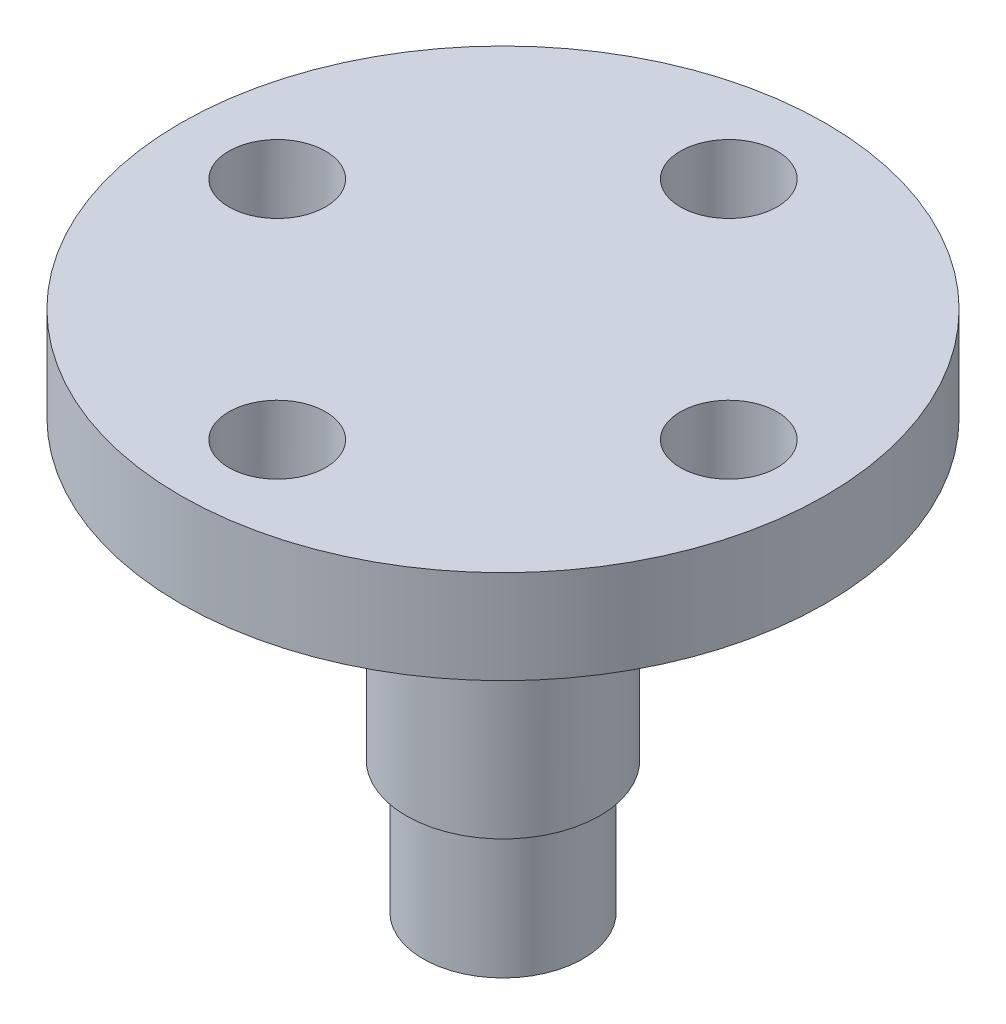
ISO-10303-21;
HEADER;
FILE_DESCRIPTION(('STEP AP214'),'2;1');
FILE_NAME('part.step','',(''),(''),'','','');
FILE_SCHEMA(('AUTOMOTIVE_DESIGN { 1 0 10303 214 1 1 1 1 }'));
ENDSEC;
DATA;
#1=APPLICATION_CONTEXT('core data for automotive mechanical design processes');
#2=APPLICATION_PROTOCOL_DEFINITION('international standard','automotive_design',2000,#1);
#3=PRODUCT_CONTEXT('',#1,'mechanical');
#4=PRODUCT('Part','Part','',(#3));
#5=PRODUCT_RELATED_PRODUCT_CATEGORY('part','',(#4));
#6=PRODUCT_DEFINITION_FORMATION('','',#4);
#7=PRODUCT_DEFINITION_CONTEXT('part definition',#1,'design');
#8=PRODUCT_DEFINITION('design','',#6,#7);
#9=PRODUCT_DEFINITION_SHAPE('','',#8);
#10=(LENGTH_UNIT() NAMED_UNIT(*) SI_UNIT(.MILLI.,.METRE.));
#11=(NAMED_UNIT(*) PLANE_ANGLE_UNIT() SI_UNIT($,.RADIAN.));
#12=(NAMED_UNIT(*) SI_UNIT($,.STERADIAN.) SOLID_ANGLE_UNIT());
#13=UNCERTAINTY_MEASURE_WITH_UNIT(LENGTH_MEASURE(1.E-05),#10,'distance_accuracy_value','');
#14=(GEOMETRIC_REPRESENTATION_CONTEXT(3) GLOBAL_UNCERTAINTY_ASSIGNED_CONTEXT((#13)) GLOBAL_UNIT_ASSIGNED_CONTEXT((#10,
#11,#12)) REPRESENTATION_CONTEXT('',''));
#15=CARTESIAN_POINT('',(0.,0.,0.));
#16=DIRECTION('',(0.,0.,1.));
#17=DIRECTION('',(1.,0.,0.));
#18=AXIS2_PLACEMENT_3D('',#15,#16,#17);
#19=CARTESIAN_POINT('',(-1.78635150621402,9.47796080297397,0.));
#20=DIRECTION('',(0.,-1.,0.));
#21=DIRECTION('',(0.,0.,-1.));
#22=AXIS2_PLACEMENT_3D('',#19,#20,#21);
#23=PLANE('',#22);
#24=CARTESIAN_POINT('',(-1.78635150621402,9.47796080297397,0.));
#25=DIRECTION('',(0.,1.,0.));
#26=DIRECTION('',(0.,0.,-1.));
#27=AXIS2_PLACEMENT_3D('',#24,#25,#26);
#28=CIRCLE('',#27,3.975);
#29=CARTESIAN_POINT('',(-1.78635150621402,9.47796080297397,-3.975));
#30=VERTEX_POINT('',#29);
#31=EDGE_CURVE('E81',#30,#30,#28,.T.);
#32=ORIENTED_EDGE('',*,*,#31,.T.);
#33=EDGE_LOOP('',(#32));
#34=FACE_BOUND('',#33,.T.);
#35=CARTESIAN_POINT('',(5.21364849377225,9.47796080297397,0.));
#36=DIRECTION('',(0.,1.,0.));
#37=DIRECTION('',(0.,0.,-1.));
#38=AXIS2_PLACEMENT_3D('',#35,#36,#37);
#39=CIRCLE('',#38,1.5);
#40=CARTESIAN_POINT('',(5.21364849377225,9.47796080297397,-1.49999999999995));
#41=VERTEX_POINT('',#40);
#42=EDGE_CURVE('E48',#41,#41,#39,.T.);
#43=ORIENTED_EDGE('',*,*,#42,.T.);
#44=EDGE_LOOP('',(#43));
#45=FACE_BOUND('',#44,.T.);
#46=CARTESIAN_POINT('',(-1.786351506214,9.47796080297397,-6.99999999998627));
#47=DIRECTION('',(0.,1.,0.));
#48=DIRECTION('',(0.,0.,-1.));
#49=AXIS2_PLACEMENT_3D('',#46,#47,#48);
#50=CIRCLE('',#49,1.5);
#51=CARTESIAN_POINT('',(-1.786351506214,9.47796080297397,-8.49999999998627));
#52=VERTEX_POINT('',#51);
#53=EDGE_CURVE('E49',#52,#52,#50,.T.);
#54=ORIENTED_EDGE('',*,*,#53,.T.);
#55=EDGE_LOOP('',(#54));
#56=FACE_BOUND('',#55,.T.);
#57=CARTESIAN_POINT('',(-8.7863515062003,9.47796080297397,0.));
#58=DIRECTION('',(0.,1.,0.));
#59=DIRECTION('',(0.,0.,-1.));
#60=AXIS2_PLACEMENT_3D('',#57,#58,#59);
#61=CIRCLE('',#60,1.5);
#62=CARTESIAN_POINT('',(-8.7863515062003,9.47796080297397,-1.5));
#63=VERTEX_POINT('',#62);
#64=EDGE_CURVE('E54',#63,#63,#61,.T.);
#65=ORIENTED_EDGE('',*,*,#64,.T.);
#66=EDGE_LOOP('',(#65));
#67=FACE_BOUND('',#66,.T.);
#68=CARTESIAN_POINT('',(-1.786351506214,9.47796080297397,6.99999999998627));
#69=DIRECTION('',(0.,1.,0.));
#70=DIRECTION('',(0.,0.,-1.));
#71=AXIS2_PLACEMENT_3D('',#68,#69,#70);
#72=CIRCLE('',#71,1.5);
#73=CARTESIAN_POINT('',(-1.786351506214,9.47796080297397,5.49999999998627));
#74=VERTEX_POINT('',#73);
#75=EDGE_CURVE('E55',#74,#74,#72,.T.);
#76=ORIENTED_EDGE('',*,*,#75,.T.);
#77=EDGE_LOOP('',(#76));
#78=FACE_BOUND('',#77,.T.);
#79=CARTESIAN_POINT('',(-1.78635150621402,9.47796080297397,0.));
#80=DIRECTION('',(0.,-1.,0.));
#81=DIRECTION('',(0.,0.,-1.));
#82=AXIS2_PLACEMENT_3D('',#79,#80,#81);
#83=CIRCLE('',#82,10.0000000000246);
#84=CARTESIAN_POINT('',(-1.78635150621402,9.47796080297397,-10.0000000000246));
#85=VERTEX_POINT('',#84);
#86=EDGE_CURVE('E138',#85,#85,#83,.T.);
#87=ORIENTED_EDGE('',*,*,#86,.T.);
#88=EDGE_LOOP('',(#87));
#89=FACE_BOUND('',#88,.T.);
#90=ADVANCED_FACE('F15',(#34,#45,#56,#67,#78,#89),#23,.T.);
#91=CARTESIAN_POINT('',(-1.78635150621402,12.3779608029706,0.));
#92=DIRECTION('',(0.,1.,0.));
#93=DIRECTION('',(1.,0.,0.));
#94=AXIS2_PLACEMENT_3D('',#91,#92,#93);
#95=PLANE('',#94);
#96=CARTESIAN_POINT('',(5.21364849377225,12.3779608029706,0.));
#97=DIRECTION('',(0.,-1.,0.));
#98=DIRECTION('',(0.,0.,1.));
#99=AXIS2_PLACEMENT_3D('',#96,#97,#98);
#100=CIRCLE('',#99,1.5);
#101=CARTESIAN_POINT('',(5.21364849377225,12.3779608029706,1.50000000000005));
#102=VERTEX_POINT('',#101);
#103=EDGE_CURVE('E74',#102,#102,#100,.T.);
#104=ORIENTED_EDGE('',*,*,#103,.T.);
#105=EDGE_LOOP('',(#104));
#106=FACE_BOUND('',#105,.T.);
#107=CARTESIAN_POINT('',(-1.786351506214,12.3779608029706,-6.99999999998627));
#108=DIRECTION('',(0.,-1.,0.));
#109=DIRECTION('',(0.,0.,1.));
#110=AXIS2_PLACEMENT_3D('',#107,#108,#109);
#111=CIRCLE('',#110,1.5);
#112=CARTESIAN_POINT('',(-1.786351506214,12.3779608029706,-5.49999999998627));
#113=VERTEX_POINT('',#112);
#114=EDGE_CURVE('E44',#113,#113,#111,.T.);
#115=ORIENTED_EDGE('',*,*,#114,.T.);
#116=EDGE_LOOP('',(#115));
#117=FACE_BOUND('',#116,.T.);
#118=CARTESIAN_POINT('',(-8.7863515062003,12.3779608029706,0.));
#119=DIRECTION('',(0.,-1.,0.));
#120=DIRECTION('',(0.,0.,1.));
#121=AXIS2_PLACEMENT_3D('',#118,#119,#120);
#122=CIRCLE('',#121,1.5);
#123=CARTESIAN_POINT('',(-8.7863515062003,12.3779608029706,1.5));
#124=VERTEX_POINT('',#123);
#125=EDGE_CURVE('E59',#124,#124,#122,.T.);
#126=ORIENTED_EDGE('',*,*,#125,.T.);
#127=EDGE_LOOP('',(#126));
#128=FACE_BOUND('',#127,.T.);
#129=CARTESIAN_POINT('',(-1.786351506214,12.3779608029706,6.99999999998627));
#130=DIRECTION('',(0.,-1.,0.));
#131=DIRECTION('',(0.,0.,1.));
#132=AXIS2_PLACEMENT_3D('',#129,#130,#131);
#133=CIRCLE('',#132,1.5);
#134=CARTESIAN_POINT('',(-1.786351506214,12.3779608029706,8.49999999998627));
#135=VERTEX_POINT('',#134);
#136=EDGE_CURVE('E50',#135,#135,#133,.T.);
#137=ORIENTED_EDGE('',*,*,#136,.T.);
#138=EDGE_LOOP('',(#137));
#139=FACE_BOUND('',#138,.T.);
#140=CARTESIAN_POINT('',(-1.78635150621402,12.3779608029706,0.));
#141=DIRECTION('',(0.,1.,0.));
#142=DIRECTION('',(0.,0.,1.));
#143=AXIS2_PLACEMENT_3D('',#140,#141,#142);
#144=CIRCLE('',#143,10.0000000000246);
#145=CARTESIAN_POINT('',(-1.78635150621402,12.3779608029706,10.0000000000246));
#146=VERTEX_POINT('',#145);
#147=EDGE_CURVE('E42',#146,#146,#144,.T.);
#148=ORIENTED_EDGE('',*,*,#147,.T.);
#149=EDGE_LOOP('',(#148));
#150=FACE_BOUND('',#149,.T.);
#151=ADVANCED_FACE('F118',(#106,#117,#128,#139,#150),#95,.T.);
#152=CARTESIAN_POINT('',(-1.78635150621402,-3.82203919697574,0.));
#153=DIRECTION('',(0.,-1.,0.));
#154=DIRECTION('',(0.,0.,-1.));
#155=AXIS2_PLACEMENT_3D('',#152,#153,#154);
#156=PLANE('',#155);
#157=CARTESIAN_POINT('',(-1.78635150621402,-3.82203919697574,0.));
#158=DIRECTION('',(0.,1.,0.));
#159=DIRECTION('',(0.,0.,-1.));
#160=AXIS2_PLACEMENT_3D('',#157,#158,#159);
#161=CIRCLE('',#160,1.05);
#162=CARTESIAN_POINT('',(-1.78635150621402,-3.82203919697574,-1.05));
#163=VERTEX_POINT('',#162);
#164=EDGE_CURVE('E31',#163,#163,#161,.T.);
#165=ORIENTED_EDGE('',*,*,#164,.T.);
#166=EDGE_LOOP('',(#165));
#167=FACE_BOUND('',#166,.T.);
#168=CARTESIAN_POINT('',(-1.78635150621402,-3.82203919697574,0.));
#169=DIRECTION('',(0.,-1.,0.));
#170=DIRECTION('',(0.,0.,-1.));
#171=AXIS2_PLACEMENT_3D('',#168,#169,#170);
#172=CIRCLE('',#171,2.48);
#173=CARTESIAN_POINT('',(-1.78635150621402,-3.82203919697574,-2.48));
#174=VERTEX_POINT('',#173);
#175=EDGE_CURVE('E63',#174,#174,#172,.T.);
#176=ORIENTED_EDGE('',*,*,#175,.T.);
#177=EDGE_LOOP('',(#176));
#178=FACE_BOUND('',#177,.T.);
#179=ADVANCED_FACE('F123',(#167,#178),#156,.T.);
#180=CARTESIAN_POINT('',(-1.78635150621402,-1.82203919697573,0.));
#181=DIRECTION('',(0.,-1.,0.));
#182=DIRECTION('',(0.,0.,-1.));
#183=AXIS2_PLACEMENT_3D('',#180,#181,#182);
#184=PLANE('',#183);
#185=CARTESIAN_POINT('',(-1.78635150621402,-1.82203919697573,0.));
#186=DIRECTION('',(0.,-1.,0.));
#187=DIRECTION('',(0.,0.,-1.));
#188=AXIS2_PLACEMENT_3D('',#185,#186,#187);
#189=CIRCLE('',#188,1.05);
#190=CARTESIAN_POINT('',(-1.78635150621402,-1.82203919697573,-1.05));
#191=VERTEX_POINT('',#190);
#192=EDGE_CURVE('E39',#191,#191,#189,.T.);
#193=ORIENTED_EDGE('',*,*,#192,.T.);
#194=EDGE_LOOP('',(#193));
#195=FACE_BOUND('',#194,.T.);
#196=ADVANCED_FACE('F302',(#195),#184,.T.);
#197=CARTESIAN_POINT('',(-1.78635150621402,0.277960802973146,0.));
#198=DIRECTION('',(0.,-1.,0.));
#199=DIRECTION('',(0.,0.,-1.));
#200=AXIS2_PLACEMENT_3D('',#197,#198,#199);
#201=PLANE('',#200);
#202=CARTESIAN_POINT('',(-1.78635150621402,0.277960802973146,0.));
#203=DIRECTION('',(0.,1.,0.));
#204=DIRECTION('',(0.,0.,-1.));
#205=AXIS2_PLACEMENT_3D('',#202,#203,#204);
#206=CIRCLE('',#205,2.48);
#207=CARTESIAN_POINT('',(-1.78635150621402,0.277960802973146,-2.48));
#208=VERTEX_POINT('',#207);
#209=EDGE_CURVE('E67',#208,#208,#206,.T.);
#210=ORIENTED_EDGE('',*,*,#209,.T.);
#211=EDGE_LOOP('',(#210));
#212=FACE_BOUND('',#211,.T.);
#213=CARTESIAN_POINT('',(-1.78635150621402,0.277960802973146,0.));
#214=DIRECTION('',(0.,-1.,0.));
#215=DIRECTION('',(0.,0.,-1.));
#216=AXIS2_PLACEMENT_3D('',#213,#214,#215);
#217=CIRCLE('',#216,3.00000000002456);
#218=CARTESIAN_POINT('',(-1.78635150621402,0.277960802973146,-3.00000000002456));
#219=VERTEX_POINT('',#218);
#220=EDGE_CURVE('E22',#219,#219,#217,.T.);
#221=ORIENTED_EDGE('',*,*,#220,.T.);
#222=EDGE_LOOP('',(#221));
#223=FACE_BOUND('',#222,.T.);
#224=ADVANCED_FACE('F95',(#212,#223),#201,.T.);
#225=CARTESIAN_POINT('',(0.,5.97796080298245,0.));
#226=DIRECTION('',(0.,1.,0.));
#227=DIRECTION('',(1.,0.,0.));
#228=AXIS2_PLACEMENT_3D('',#225,#226,#227);
#229=PLANE('',#228);
#230=CARTESIAN_POINT('',(-1.78635150621402,5.97796080298529,0.));
#231=DIRECTION('',(0.,1.,0.));
#232=DIRECTION('',(0.,0.,1.));
#233=AXIS2_PLACEMENT_3D('',#230,#231,#232);
#234=CIRCLE('',#233,3.00000000002456);
#235=CARTESIAN_POINT('',(-1.78635150621402,5.97796080298529,3.00000000002456));
#236=VERTEX_POINT('',#235);
#237=EDGE_CURVE('E10',#236,#236,#234,.T.);
#238=ORIENTED_EDGE('',*,*,#237,.T.);
#239=EDGE_LOOP('',(#238));
#240=FACE_BOUND('',#239,.T.);
#241=CARTESIAN_POINT('',(-1.78635150621402,5.97796080298245,0.));
#242=DIRECTION('',(0.,-1.,0.));
#243=DIRECTION('',(0.,0.,-1.));
#244=AXIS2_PLACEMENT_3D('',#241,#242,#243);
#245=CIRCLE('',#244,3.975);
#246=CARTESIAN_POINT('',(-1.78635150621402,5.97796080298245,-3.975));
#247=VERTEX_POINT('',#246);
#248=EDGE_CURVE('E85',#247,#247,#245,.T.);
#249=ORIENTED_EDGE('',*,*,#248,.T.);
#250=EDGE_LOOP('',(#249));
#251=FACE_BOUND('',#250,.T.);
#252=ADVANCED_FACE('F282',(#240,#251),#229,.F.);
#253=CARTESIAN_POINT('',(-1.78635150621402,28.3779608029711,0.));
#254=DIRECTION('',(0.,1.,0.));
#255=DIRECTION('',(0.,0.,1.));
#256=AXIS2_PLACEMENT_3D('',#253,#254,#255);
#257=CYLINDRICAL_SURFACE('',#256,3.00000000002456);
#258=ORIENTED_EDGE('',*,*,#237,.F.);
#259=EDGE_LOOP('',(#258));
#260=FACE_BOUND('',#259,.T.);
#261=ORIENTED_EDGE('',*,*,#220,.F.);
#262=EDGE_LOOP('',(#261));
#263=FACE_BOUND('',#262,.T.);
#264=ADVANCED_FACE('F111',(#260,#263),#257,.T.);
#265=CARTESIAN_POINT('',(-1.78635150621402,-1.82203919697573,0.));
#266=DIRECTION('',(0.,-1.,0.));
#267=DIRECTION('',(0.,0.,-1.));
#268=AXIS2_PLACEMENT_3D('',#265,#266,#267);
#269=CYLINDRICAL_SURFACE('',#268,1.05);
#270=ORIENTED_EDGE('',*,*,#164,.F.);
#271=EDGE_LOOP('',(#270));
#272=FACE_BOUND('',#271,.T.);
#273=ORIENTED_EDGE('',*,*,#192,.F.);
#274=EDGE_LOOP('',(#273));
#275=FACE_BOUND('',#274,.T.);
#276=ADVANCED_FACE('F100',(#272,#275),#269,.F.);
#277=CARTESIAN_POINT('',(-1.78635150621402,0.377960803024265,0.));
#278=DIRECTION('',(0.,-1.,0.));
#279=DIRECTION('',(0.,0.,-1.));
#280=AXIS2_PLACEMENT_3D('',#277,#278,#279);
#281=CYLINDRICAL_SURFACE('',#280,2.48);
#282=ORIENTED_EDGE('',*,*,#175,.F.);
#283=EDGE_LOOP('',(#282));
#284=FACE_BOUND('',#283,.T.);
#285=ORIENTED_EDGE('',*,*,#209,.F.);
#286=EDGE_LOOP('',(#285));
#287=FACE_BOUND('',#286,.T.);
#288=ADVANCED_FACE('F97',(#284,#287),#281,.T.);
#289=CARTESIAN_POINT('',(-1.78635150621402,20.7916693016783,0.));
#290=DIRECTION('',(0.,-1.,0.));
#291=DIRECTION('',(0.,0.,-1.));
#292=AXIS2_PLACEMENT_3D('',#289,#290,#291);
#293=CYLINDRICAL_SURFACE('',#292,3.975);
#294=ORIENTED_EDGE('',*,*,#248,.F.);
#295=EDGE_LOOP('',(#294));
#296=FACE_BOUND('',#295,.T.);
#297=ORIENTED_EDGE('',*,*,#31,.F.);
#298=EDGE_LOOP('',(#297));
#299=FACE_BOUND('',#298,.T.);
#300=ADVANCED_FACE('F99',(#296,#299),#293,.T.);
#301=CARTESIAN_POINT('',(5.21364849377225,6.77796080297416,0.));
#302=DIRECTION('',(0.,1.,0.));
#303=DIRECTION('',(0.,0.,1.));
#304=AXIS2_PLACEMENT_3D('',#301,#302,#303);
#305=CYLINDRICAL_SURFACE('',#304,1.5);
#306=ORIENTED_EDGE('',*,*,#103,.F.);
#307=EDGE_LOOP('',(#306));
#308=FACE_BOUND('',#307,.T.);
#309=ORIENTED_EDGE('',*,*,#42,.F.);
#310=EDGE_LOOP('',(#309));
#311=FACE_BOUND('',#310,.T.);
#312=ADVANCED_FACE('F108',(#308,#311),#305,.F.);
#313=CARTESIAN_POINT('',(-1.786351506214,6.77796080297416,-6.99999999998627));
#314=DIRECTION('',(0.,1.,0.));
#315=DIRECTION('',(0.,0.,1.));
#316=AXIS2_PLACEMENT_3D('',#313,#314,#315);
#317=CYLINDRICAL_SURFACE('',#316,1.5);
#318=ORIENTED_EDGE('',*,*,#114,.F.);
#319=EDGE_LOOP('',(#318));
#320=FACE_BOUND('',#319,.T.);
#321=ORIENTED_EDGE('',*,*,#53,.F.);
#322=EDGE_LOOP('',(#321));
#323=FACE_BOUND('',#322,.T.);
#324=ADVANCED_FACE('F253',(#320,#323),#317,.F.);
#325=CARTESIAN_POINT('',(-8.7863515062003,6.77796080297416,0.));
#326=DIRECTION('',(0.,1.,0.));
#327=DIRECTION('',(0.,0.,1.));
#328=AXIS2_PLACEMENT_3D('',#325,#326,#327);
#329=CYLINDRICAL_SURFACE('',#328,1.5);
#330=ORIENTED_EDGE('',*,*,#125,.F.);
#331=EDGE_LOOP('',(#330));
#332=FACE_BOUND('',#331,.T.);
#333=ORIENTED_EDGE('',*,*,#64,.F.);
#334=EDGE_LOOP('',(#333));
#335=FACE_BOUND('',#334,.T.);
#336=ADVANCED_FACE('F244',(#332,#335),#329,.F.);
#337=CARTESIAN_POINT('',(-1.786351506214,6.77796080297416,6.99999999998627));
#338=DIRECTION('',(0.,1.,0.));
#339=DIRECTION('',(0.,0.,1.));
#340=AXIS2_PLACEMENT_3D('',#337,#338,#339);
#341=CYLINDRICAL_SURFACE('',#340,1.5);
#342=ORIENTED_EDGE('',*,*,#136,.F.);
#343=EDGE_LOOP('',(#342));
#344=FACE_BOUND('',#343,.T.);
#345=ORIENTED_EDGE('',*,*,#75,.F.);
#346=EDGE_LOOP('',(#345));
#347=FACE_BOUND('',#346,.T.);
#348=ADVANCED_FACE('F231',(#344,#347),#341,.F.);
#349=CARTESIAN_POINT('',(-1.78635150621402,28.3779608029711,0.));
#350=DIRECTION('',(0.,1.,0.));
#351=DIRECTION('',(0.,0.,1.));
#352=AXIS2_PLACEMENT_3D('',#349,#350,#351);
#353=CYLINDRICAL_SURFACE('',#352,10.0000000000246);
#354=ORIENTED_EDGE('',*,*,#147,.F.);
#355=EDGE_LOOP('',(#354));
#356=FACE_BOUND('',#355,.T.);
#357=ORIENTED_EDGE('',*,*,#86,.F.);
#358=EDGE_LOOP('',(#357));
#359=FACE_BOUND('',#358,.T.);
#360=ADVANCED_FACE('F227',(#356,#359),#353,.T.);
#361=CLOSED_SHELL('',(#90,#151,#179,#196,#224,#252,#264,#276,#288,#300,#312,#324,#336,#348,#360));
#362=MANIFOLD_SOLID_BREP('B1',#361);
#363=ADVANCED_BREP_SHAPE_REPRESENTATION('',(#18,#362),#14);
#364=SHAPE_DEFINITION_REPRESENTATION(#9,#363);
ENDSEC;
END-ISO-10303-21;
